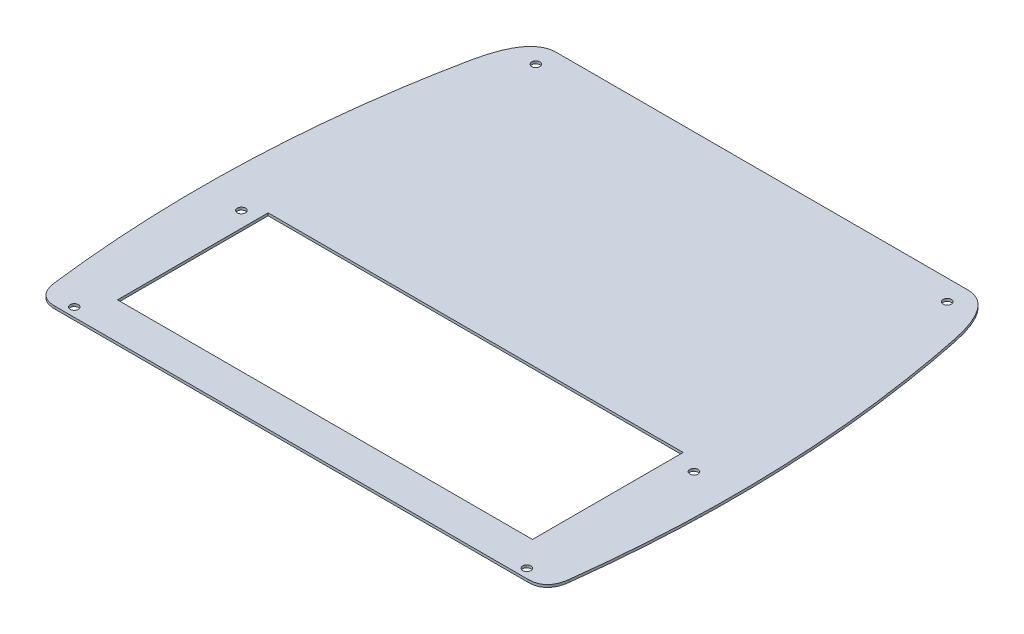
ISO-10303-21;
HEADER;
FILE_DESCRIPTION(('STEP AP214'),'2;1');
FILE_NAME('part.step','',(''),(''),'','','');
FILE_SCHEMA(('AUTOMOTIVE_DESIGN { 1 0 10303 214 1 1 1 1 }'));
ENDSEC;
DATA;
#1=APPLICATION_CONTEXT('core data for automotive mechanical design processes');
#2=APPLICATION_PROTOCOL_DEFINITION('international standard','automotive_design',2000,#1);
#3=PRODUCT_CONTEXT('',#1,'mechanical');
#4=PRODUCT('Part','Part','',(#3));
#5=PRODUCT_RELATED_PRODUCT_CATEGORY('part','',(#4));
#6=PRODUCT_DEFINITION_FORMATION('','',#4);
#7=PRODUCT_DEFINITION_CONTEXT('part definition',#1,'design');
#8=PRODUCT_DEFINITION('design','',#6,#7);
#9=PRODUCT_DEFINITION_SHAPE('','',#8);
#10=(LENGTH_UNIT() NAMED_UNIT(*) SI_UNIT(.MILLI.,.METRE.));
#11=(NAMED_UNIT(*) PLANE_ANGLE_UNIT() SI_UNIT($,.RADIAN.));
#12=(NAMED_UNIT(*) SI_UNIT($,.STERADIAN.) SOLID_ANGLE_UNIT());
#13=UNCERTAINTY_MEASURE_WITH_UNIT(LENGTH_MEASURE(1.E-05),#10,'distance_accuracy_value','');
#14=(GEOMETRIC_REPRESENTATION_CONTEXT(3) GLOBAL_UNCERTAINTY_ASSIGNED_CONTEXT((#13)) GLOBAL_UNIT_ASSIGNED_CONTEXT((#10,
#11,#12)) REPRESENTATION_CONTEXT('',''));
#15=CARTESIAN_POINT('',(0.,0.,0.));
#16=DIRECTION('',(0.,0.,1.));
#17=DIRECTION('',(1.,0.,0.));
#18=AXIS2_PLACEMENT_3D('',#15,#16,#17);
#19=CARTESIAN_POINT('',(-92.,1.,0.));
#20=CARTESIAN_POINT('',(-99.,1.,0.));
#21=CARTESIAN_POINT('',(-100.,1.,-8.));
#22=B_SPLINE_CURVE_WITH_KNOTS('',2,(#19,#20,#21),.UNSPECIFIED.,.F.,.F.,(3,3),(0.,1.),.UNSPECIFIED.);
#23=DIRECTION('',(0.,-1.,0.));
#24=VECTOR('',#23,1.);
#25=SURFACE_OF_LINEAR_EXTRUSION('',#22,#24);
#26=CARTESIAN_POINT('',(-92.,0.,0.));
#27=CARTESIAN_POINT('',(-99.,0.,0.));
#28=CARTESIAN_POINT('',(-100.,0.,-8.));
#29=B_SPLINE_CURVE_WITH_KNOTS('',2,(#26,#27,#28),.UNSPECIFIED.,.F.,.F.,(3,3),(0.,1.),.UNSPECIFIED.);
#30=CARTESIAN_POINT('',(-92.,0.,0.));
#31=VERTEX_POINT('',#30);
#32=CARTESIAN_POINT('',(-100.,0.,-8.));
#33=VERTEX_POINT('',#32);
#34=EDGE_CURVE('E184',#31,#33,#29,.T.);
#35=ORIENTED_EDGE('',*,*,#34,.F.);
#36=DIRECTION('',(0.,-1.,0.));
#37=VECTOR('',#36,1.);
#38=CARTESIAN_POINT('',(-92.,1.,0.));
#39=LINE('',#38,#37);
#40=CARTESIAN_POINT('',(-92.,1.,0.));
#41=VERTEX_POINT('',#40);
#42=EDGE_CURVE('E11',#41,#31,#39,.T.);
#43=ORIENTED_EDGE('',*,*,#42,.F.);
#44=CARTESIAN_POINT('',(-100.,1.,-8.));
#45=VERTEX_POINT('',#44);
#46=EDGE_CURVE('E186',#41,#45,#22,.T.);
#47=ORIENTED_EDGE('',*,*,#46,.T.);
#48=DIRECTION('',(0.,-1.,0.));
#49=VECTOR('',#48,1.);
#50=CARTESIAN_POINT('',(-100.,1.,-8.));
#51=LINE('',#50,#49);
#52=EDGE_CURVE('E36',#45,#33,#51,.T.);
#53=ORIENTED_EDGE('',*,*,#52,.T.);
#54=EDGE_LOOP('',(#35,#43,#47,#53));
#55=FACE_BOUND('',#54,.T.);
#56=ADVANCED_FACE('F32',(#55),#25,.T.);
#57=CARTESIAN_POINT('',(92.,1.,0.));
#58=DIRECTION('',(0.,0.,1.));
#59=DIRECTION('',(1.,0.,0.));
#60=AXIS2_PLACEMENT_3D('',#57,#58,#59);
#61=PLANE('',#60);
#62=DIRECTION('',(-1.,0.,0.));
#63=VECTOR('',#62,1.);
#64=CARTESIAN_POINT('',(92.,0.,0.));
#65=LINE('',#64,#63);
#66=CARTESIAN_POINT('',(92.,0.,0.));
#67=VERTEX_POINT('',#66);
#68=EDGE_CURVE('E193',#67,#31,#65,.T.);
#69=ORIENTED_EDGE('',*,*,#68,.F.);
#70=DIRECTION('',(0.,-1.,0.));
#71=VECTOR('',#70,1.);
#72=CARTESIAN_POINT('',(92.,1.,0.));
#73=LINE('',#72,#71);
#74=CARTESIAN_POINT('',(92.,1.,0.));
#75=VERTEX_POINT('',#74);
#76=EDGE_CURVE('E41',#75,#67,#73,.T.);
#77=ORIENTED_EDGE('',*,*,#76,.F.);
#78=DIRECTION('',(-1.,0.,0.));
#79=VECTOR('',#78,1.);
#80=CARTESIAN_POINT('',(92.,1.,0.));
#81=LINE('',#80,#79);
#82=EDGE_CURVE('E252',#75,#41,#81,.T.);
#83=ORIENTED_EDGE('',*,*,#82,.T.);
#84=ORIENTED_EDGE('',*,*,#42,.T.);
#85=EDGE_LOOP('',(#69,#77,#83,#84));
#86=FACE_BOUND('',#85,.T.);
#87=ADVANCED_FACE('F260',(#86),#61,.T.);
#88=CARTESIAN_POINT('',(92.,1.,0.));
#89=CARTESIAN_POINT('',(99.,1.,0.));
#90=CARTESIAN_POINT('',(100.,1.,-8.));
#91=B_SPLINE_CURVE_WITH_KNOTS('',2,(#88,#89,#90),.UNSPECIFIED.,.F.,.F.,(3,3),(0.,1.),.UNSPECIFIED.);
#92=DIRECTION('',(0.,-1.,0.));
#93=VECTOR('',#92,1.);
#94=SURFACE_OF_LINEAR_EXTRUSION('',#91,#93);
#95=CARTESIAN_POINT('',(92.,0.,0.));
#96=CARTESIAN_POINT('',(99.,0.,0.));
#97=CARTESIAN_POINT('',(100.,0.,-8.));
#98=B_SPLINE_CURVE_WITH_KNOTS('',2,(#95,#96,#97),.UNSPECIFIED.,.F.,.F.,(3,3),(0.,1.),.UNSPECIFIED.);
#99=CARTESIAN_POINT('',(100.,0.,-8.));
#100=VERTEX_POINT('',#99);
#101=EDGE_CURVE('E323',#67,#100,#98,.T.);
#102=ORIENTED_EDGE('',*,*,#101,.T.);
#103=DIRECTION('',(0.,-1.,0.));
#104=VECTOR('',#103,1.);
#105=CARTESIAN_POINT('',(100.,1.,-8.));
#106=LINE('',#105,#104);
#107=CARTESIAN_POINT('',(100.,1.,-8.));
#108=VERTEX_POINT('',#107);
#109=EDGE_CURVE('E332',#108,#100,#106,.T.);
#110=ORIENTED_EDGE('',*,*,#109,.F.);
#111=EDGE_CURVE('E244',#75,#108,#91,.T.);
#112=ORIENTED_EDGE('',*,*,#111,.F.);
#113=ORIENTED_EDGE('',*,*,#76,.T.);
#114=EDGE_LOOP('',(#102,#110,#112,#113));
#115=FACE_BOUND('',#114,.T.);
#116=ADVANCED_FACE('F257',(#115),#94,.F.);
#117=CARTESIAN_POINT('',(100.,1.,-8.));
#118=CARTESIAN_POINT('',(109.749547472412,1.,-87.4036921313057));
#119=CARTESIAN_POINT('',(94.,1.,-164.));
#120=B_SPLINE_CURVE_WITH_KNOTS('',2,(#117,#118,#119),.UNSPECIFIED.,.F.,.F.,(3,3),(0.,1.),.UNSPECIFIED.);
#121=DIRECTION('',(0.,-1.,0.));
#122=VECTOR('',#121,1.);
#123=SURFACE_OF_LINEAR_EXTRUSION('',#120,#122);
#124=CARTESIAN_POINT('',(100.,0.,-8.));
#125=CARTESIAN_POINT('',(109.749547472412,0.,-87.4036921313057));
#126=CARTESIAN_POINT('',(94.,0.,-164.));
#127=B_SPLINE_CURVE_WITH_KNOTS('',2,(#124,#125,#126),.UNSPECIFIED.,.F.,.F.,(3,3),(0.,1.),.UNSPECIFIED.);
#128=CARTESIAN_POINT('',(94.,0.,-164.));
#129=VERTEX_POINT('',#128);
#130=EDGE_CURVE('E325',#100,#129,#127,.T.);
#131=ORIENTED_EDGE('',*,*,#130,.T.);
#132=DIRECTION('',(0.,-1.,0.));
#133=VECTOR('',#132,1.);
#134=CARTESIAN_POINT('',(94.,1.,-164.));
#135=LINE('',#134,#133);
#136=CARTESIAN_POINT('',(94.,1.,-164.));
#137=VERTEX_POINT('',#136);
#138=EDGE_CURVE('E335',#137,#129,#135,.T.);
#139=ORIENTED_EDGE('',*,*,#138,.F.);
#140=EDGE_CURVE('E235',#108,#137,#120,.T.);
#141=ORIENTED_EDGE('',*,*,#140,.F.);
#142=ORIENTED_EDGE('',*,*,#109,.T.);
#143=EDGE_LOOP('',(#131,#139,#141,#142));
#144=FACE_BOUND('',#143,.T.);
#145=ADVANCED_FACE('F227',(#144),#123,.F.);
#146=CARTESIAN_POINT('',(94.,1.,-164.));
#147=CARTESIAN_POINT('',(90.,1.,-183.));
#148=CARTESIAN_POINT('',(80.,1.,-183.));
#149=B_SPLINE_CURVE_WITH_KNOTS('',2,(#146,#147,#148),.UNSPECIFIED.,.F.,.F.,(3,3),(0.,1.),.UNSPECIFIED.);
#150=DIRECTION('',(0.,-1.,0.));
#151=VECTOR('',#150,1.);
#152=SURFACE_OF_LINEAR_EXTRUSION('',#149,#151);
#153=CARTESIAN_POINT('',(94.,0.,-164.));
#154=CARTESIAN_POINT('',(90.,0.,-183.));
#155=CARTESIAN_POINT('',(80.,0.,-183.));
#156=B_SPLINE_CURVE_WITH_KNOTS('',2,(#153,#154,#155),.UNSPECIFIED.,.F.,.F.,(3,3),(0.,1.),.UNSPECIFIED.);
#157=CARTESIAN_POINT('',(80.,0.,-183.));
#158=VERTEX_POINT('',#157);
#159=EDGE_CURVE('E372',#129,#158,#156,.T.);
#160=ORIENTED_EDGE('',*,*,#159,.T.);
#161=DIRECTION('',(0.,-1.,0.));
#162=VECTOR('',#161,1.);
#163=CARTESIAN_POINT('',(80.,1.,-183.));
#164=LINE('',#163,#162);
#165=CARTESIAN_POINT('',(80.,1.,-183.));
#166=VERTEX_POINT('',#165);
#167=EDGE_CURVE('E338',#166,#158,#164,.T.);
#168=ORIENTED_EDGE('',*,*,#167,.F.);
#169=EDGE_CURVE('E231',#137,#166,#149,.T.);
#170=ORIENTED_EDGE('',*,*,#169,.F.);
#171=ORIENTED_EDGE('',*,*,#138,.T.);
#172=EDGE_LOOP('',(#160,#168,#170,#171));
#173=FACE_BOUND('',#172,.T.);
#174=ADVANCED_FACE('F222',(#173),#152,.F.);
#175=CARTESIAN_POINT('',(-80.,1.,-183.));
#176=DIRECTION('',(0.,0.,-1.));
#177=DIRECTION('',(-1.,0.,0.));
#178=AXIS2_PLACEMENT_3D('',#175,#176,#177);
#179=PLANE('',#178);
#180=DIRECTION('',(1.,0.,0.));
#181=VECTOR('',#180,1.);
#182=CARTESIAN_POINT('',(-80.,0.,-183.));
#183=LINE('',#182,#181);
#184=CARTESIAN_POINT('',(-80.,0.,-183.));
#185=VERTEX_POINT('',#184);
#186=EDGE_CURVE('E355',#185,#158,#183,.T.);
#187=ORIENTED_EDGE('',*,*,#186,.F.);
#188=DIRECTION('',(0.,-1.,0.));
#189=VECTOR('',#188,1.);
#190=CARTESIAN_POINT('',(-80.,1.,-183.));
#191=LINE('',#190,#189);
#192=CARTESIAN_POINT('',(-80.,1.,-183.));
#193=VERTEX_POINT('',#192);
#194=EDGE_CURVE('E340',#193,#185,#191,.T.);
#195=ORIENTED_EDGE('',*,*,#194,.F.);
#196=DIRECTION('',(1.,0.,0.));
#197=VECTOR('',#196,1.);
#198=CARTESIAN_POINT('',(-80.,1.,-183.));
#199=LINE('',#198,#197);
#200=EDGE_CURVE('E236',#193,#166,#199,.T.);
#201=ORIENTED_EDGE('',*,*,#200,.T.);
#202=ORIENTED_EDGE('',*,*,#167,.T.);
#203=EDGE_LOOP('',(#187,#195,#201,#202));
#204=FACE_BOUND('',#203,.T.);
#205=ADVANCED_FACE('F218',(#204),#179,.T.);
#206=CARTESIAN_POINT('',(-94.,1.,-164.));
#207=CARTESIAN_POINT('',(-90.,1.,-183.));
#208=CARTESIAN_POINT('',(-80.,1.,-183.));
#209=B_SPLINE_CURVE_WITH_KNOTS('',2,(#206,#207,#208),.UNSPECIFIED.,.F.,.F.,(3,3),(0.,1.),.UNSPECIFIED.);
#210=DIRECTION('',(0.,-1.,0.));
#211=VECTOR('',#210,1.);
#212=SURFACE_OF_LINEAR_EXTRUSION('',#209,#211);
#213=CARTESIAN_POINT('',(-94.,0.,-164.));
#214=CARTESIAN_POINT('',(-90.,0.,-183.));
#215=CARTESIAN_POINT('',(-80.,0.,-183.));
#216=B_SPLINE_CURVE_WITH_KNOTS('',2,(#213,#214,#215),.UNSPECIFIED.,.F.,.F.,(3,3),(0.,1.),.UNSPECIFIED.);
#217=CARTESIAN_POINT('',(-94.,0.,-164.));
#218=VERTEX_POINT('',#217);
#219=EDGE_CURVE('E353',#218,#185,#216,.T.);
#220=ORIENTED_EDGE('',*,*,#219,.F.);
#221=DIRECTION('',(0.,-1.,0.));
#222=VECTOR('',#221,1.);
#223=CARTESIAN_POINT('',(-94.,1.,-164.));
#224=LINE('',#223,#222);
#225=CARTESIAN_POINT('',(-94.,1.,-164.));
#226=VERTEX_POINT('',#225);
#227=EDGE_CURVE('E341',#226,#218,#224,.T.);
#228=ORIENTED_EDGE('',*,*,#227,.F.);
#229=EDGE_CURVE('E202',#226,#193,#209,.T.);
#230=ORIENTED_EDGE('',*,*,#229,.T.);
#231=ORIENTED_EDGE('',*,*,#194,.T.);
#232=EDGE_LOOP('',(#220,#228,#230,#231));
#233=FACE_BOUND('',#232,.T.);
#234=ADVANCED_FACE('F214',(#233),#212,.T.);
#235=CARTESIAN_POINT('',(-100.,1.,-8.));
#236=CARTESIAN_POINT('',(-109.749547472412,1.,-87.4036921313057));
#237=CARTESIAN_POINT('',(-94.,1.,-164.));
#238=B_SPLINE_CURVE_WITH_KNOTS('',2,(#235,#236,#237),.UNSPECIFIED.,.F.,.F.,(3,3),(0.,1.),.UNSPECIFIED.);
#239=DIRECTION('',(0.,-1.,0.));
#240=VECTOR('',#239,1.);
#241=SURFACE_OF_LINEAR_EXTRUSION('',#238,#240);
#242=CARTESIAN_POINT('',(-100.,0.,-8.));
#243=CARTESIAN_POINT('',(-109.749547472412,0.,-87.4036921313057));
#244=CARTESIAN_POINT('',(-94.,0.,-164.));
#245=B_SPLINE_CURVE_WITH_KNOTS('',2,(#242,#243,#244),.UNSPECIFIED.,.F.,.F.,(3,3),(0.,1.),.UNSPECIFIED.);
#246=EDGE_CURVE('E319',#33,#218,#245,.T.);
#247=ORIENTED_EDGE('',*,*,#246,.F.);
#248=ORIENTED_EDGE('',*,*,#52,.F.);
#249=EDGE_CURVE('E192',#45,#226,#238,.T.);
#250=ORIENTED_EDGE('',*,*,#249,.T.);
#251=ORIENTED_EDGE('',*,*,#227,.T.);
#252=EDGE_LOOP('',(#247,#248,#250,#251));
#253=FACE_BOUND('',#252,.T.);
#254=ADVANCED_FACE('F210',(#253),#241,.T.);
#255=CARTESIAN_POINT('',(-97.5,1.,-2.00000000000002));
#256=DIRECTION('',(0.,1.,0.));
#257=DIRECTION('',(0.,0.,1.));
#258=AXIS2_PLACEMENT_3D('',#255,#256,#257);
#259=PLANE('',#258);
#260=DIRECTION('',(0.,0.,-1.));
#261=VECTOR('',#260,1.);
#262=CARTESIAN_POINT('',(79.4,1.,-14.3));
#263=LINE('',#262,#261);
#264=CARTESIAN_POINT('',(79.4,1.,-14.3));
#265=VERTEX_POINT('',#264);
#266=CARTESIAN_POINT('',(79.4,1.,-72.9));
#267=VERTEX_POINT('',#266);
#268=EDGE_CURVE('E49',#265,#267,#263,.T.);
#269=ORIENTED_EDGE('',*,*,#268,.F.);
#270=DIRECTION('',(1.,0.,0.));
#271=VECTOR('',#270,1.);
#272=CARTESIAN_POINT('',(-82.,1.,-14.3));
#273=LINE('',#272,#271);
#274=CARTESIAN_POINT('',(-82.,1.,-14.3));
#275=VERTEX_POINT('',#274);
#276=EDGE_CURVE('E140',#275,#265,#273,.T.);
#277=ORIENTED_EDGE('',*,*,#276,.F.);
#278=DIRECTION('',(0.,0.,1.));
#279=VECTOR('',#278,1.);
#280=CARTESIAN_POINT('',(-82.,1.,-14.3));
#281=LINE('',#280,#279);
#282=CARTESIAN_POINT('',(-82.,1.,-72.9));
#283=VERTEX_POINT('',#282);
#284=EDGE_CURVE('E143',#283,#275,#281,.T.);
#285=ORIENTED_EDGE('',*,*,#284,.F.);
#286=DIRECTION('',(-1.,0.,0.));
#287=VECTOR('',#286,1.);
#288=CARTESIAN_POINT('',(-82.,1.,-72.9));
#289=LINE('',#288,#287);
#290=EDGE_CURVE('E152',#267,#283,#289,.T.);
#291=ORIENTED_EDGE('',*,*,#290,.F.);
#292=EDGE_LOOP('',(#269,#277,#285,#291));
#293=FACE_BOUND('',#292,.T.);
#294=CARTESIAN_POINT('',(88.,1.,-68.5));
#295=DIRECTION('',(0.,1.,0.));
#296=DIRECTION('',(0.,0.,1.));
#297=AXIS2_PLACEMENT_3D('',#294,#295,#296);
#298=CIRCLE('',#297,1.60000000000001);
#299=CARTESIAN_POINT('',(88.,1.,-66.9));
#300=VERTEX_POINT('',#299);
#301=EDGE_CURVE('E518',#300,#300,#298,.T.);
#302=ORIENTED_EDGE('',*,*,#301,.F.);
#303=EDGE_LOOP('',(#302));
#304=FACE_BOUND('',#303,.T.);
#305=CARTESIAN_POINT('',(-88.,1.,-68.5));
#306=DIRECTION('',(0.,1.,0.));
#307=DIRECTION('',(0.,0.,1.));
#308=AXIS2_PLACEMENT_3D('',#305,#306,#307);
#309=CIRCLE('',#308,1.60000000000001);
#310=CARTESIAN_POINT('',(-88.,1.,-66.9));
#311=VERTEX_POINT('',#310);
#312=EDGE_CURVE('E146',#311,#311,#309,.T.);
#313=ORIENTED_EDGE('',*,*,#312,.F.);
#314=EDGE_LOOP('',(#313));
#315=FACE_BOUND('',#314,.T.);
#316=CARTESIAN_POINT('',(80.,1.,-175.));
#317=DIRECTION('',(0.,1.,0.));
#318=DIRECTION('',(0.,0.,-1.));
#319=AXIS2_PLACEMENT_3D('',#316,#317,#318);
#320=CIRCLE('',#319,1.6);
#321=CARTESIAN_POINT('',(80.,1.,-176.6));
#322=VERTEX_POINT('',#321);
#323=EDGE_CURVE('E166',#322,#322,#320,.T.);
#324=ORIENTED_EDGE('',*,*,#323,.F.);
#325=EDGE_LOOP('',(#324));
#326=FACE_BOUND('',#325,.T.);
#327=CARTESIAN_POINT('',(88.,1.,-3.5));
#328=DIRECTION('',(0.,1.,0.));
#329=DIRECTION('',(0.,0.,-1.));
#330=AXIS2_PLACEMENT_3D('',#327,#328,#329);
#331=CIRCLE('',#330,1.60000000000001);
#332=CARTESIAN_POINT('',(88.,1.,-5.1));
#333=VERTEX_POINT('',#332);
#334=EDGE_CURVE('E167',#333,#333,#331,.T.);
#335=ORIENTED_EDGE('',*,*,#334,.F.);
#336=EDGE_LOOP('',(#335));
#337=FACE_BOUND('',#336,.T.);
#338=CARTESIAN_POINT('',(-80.,1.,-175.));
#339=DIRECTION('',(0.,1.,0.));
#340=DIRECTION('',(0.,0.,1.));
#341=AXIS2_PLACEMENT_3D('',#338,#339,#340);
#342=CIRCLE('',#341,1.6);
#343=CARTESIAN_POINT('',(-80.,1.,-173.4));
#344=VERTEX_POINT('',#343);
#345=EDGE_CURVE('E159',#344,#344,#342,.T.);
#346=ORIENTED_EDGE('',*,*,#345,.F.);
#347=EDGE_LOOP('',(#346));
#348=FACE_BOUND('',#347,.T.);
#349=CARTESIAN_POINT('',(-88.,1.,-3.5));
#350=DIRECTION('',(0.,1.,0.));
#351=DIRECTION('',(0.,0.,1.));
#352=AXIS2_PLACEMENT_3D('',#349,#350,#351);
#353=CIRCLE('',#352,1.60000000000001);
#354=CARTESIAN_POINT('',(-88.,1.,-1.89999999999999));
#355=VERTEX_POINT('',#354);
#356=EDGE_CURVE('E178',#355,#355,#353,.T.);
#357=ORIENTED_EDGE('',*,*,#356,.F.);
#358=EDGE_LOOP('',(#357));
#359=FACE_BOUND('',#358,.T.);
#360=ORIENTED_EDGE('',*,*,#46,.F.);
#361=ORIENTED_EDGE('',*,*,#82,.F.);
#362=ORIENTED_EDGE('',*,*,#111,.T.);
#363=ORIENTED_EDGE('',*,*,#140,.T.);
#364=ORIENTED_EDGE('',*,*,#169,.T.);
#365=ORIENTED_EDGE('',*,*,#200,.F.);
#366=ORIENTED_EDGE('',*,*,#229,.F.);
#367=ORIENTED_EDGE('',*,*,#249,.F.);
#368=EDGE_LOOP('',(#360,#361,#362,#363,#364,#365,#366,#367));
#369=FACE_BOUND('',#368,.T.);
#370=ADVANCED_FACE('F213',(#293,#304,#315,#326,#337,#348,#359,#369),#259,.T.);
#371=CARTESIAN_POINT('',(-97.5,0.,-2.00000000000002));
#372=DIRECTION('',(0.,1.,0.));
#373=DIRECTION('',(0.,0.,1.));
#374=AXIS2_PLACEMENT_3D('',#371,#372,#373);
#375=PLANE('',#374);
#376=DIRECTION('',(1.,0.,0.));
#377=VECTOR('',#376,1.);
#378=CARTESIAN_POINT('',(-82.,0.,-14.3));
#379=LINE('',#378,#377);
#380=CARTESIAN_POINT('',(-82.,0.,-14.3));
#381=VERTEX_POINT('',#380);
#382=CARTESIAN_POINT('',(79.4,0.,-14.3));
#383=VERTEX_POINT('',#382);
#384=EDGE_CURVE('E130',#381,#383,#379,.T.);
#385=ORIENTED_EDGE('',*,*,#384,.T.);
#386=DIRECTION('',(0.,0.,-1.));
#387=VECTOR('',#386,1.);
#388=CARTESIAN_POINT('',(79.4,0.,-14.3));
#389=LINE('',#388,#387);
#390=CARTESIAN_POINT('',(79.4,0.,-72.9));
#391=VERTEX_POINT('',#390);
#392=EDGE_CURVE('E124',#383,#391,#389,.T.);
#393=ORIENTED_EDGE('',*,*,#392,.T.);
#394=DIRECTION('',(-1.,0.,0.));
#395=VECTOR('',#394,1.);
#396=CARTESIAN_POINT('',(-82.,0.,-72.9));
#397=LINE('',#396,#395);
#398=CARTESIAN_POINT('',(-82.,0.,-72.9));
#399=VERTEX_POINT('',#398);
#400=EDGE_CURVE('E133',#391,#399,#397,.T.);
#401=ORIENTED_EDGE('',*,*,#400,.T.);
#402=DIRECTION('',(0.,0.,1.));
#403=VECTOR('',#402,1.);
#404=CARTESIAN_POINT('',(-82.,0.,-14.3));
#405=LINE('',#404,#403);
#406=EDGE_CURVE('E57',#399,#381,#405,.T.);
#407=ORIENTED_EDGE('',*,*,#406,.T.);
#408=EDGE_LOOP('',(#385,#393,#401,#407));
#409=FACE_BOUND('',#408,.T.);
#410=CARTESIAN_POINT('',(88.,0.,-68.5));
#411=DIRECTION('',(0.,1.,0.));
#412=DIRECTION('',(0.,0.,1.));
#413=AXIS2_PLACEMENT_3D('',#410,#411,#412);
#414=CIRCLE('',#413,1.60000000000001);
#415=CARTESIAN_POINT('',(88.,0.,-66.9));
#416=VERTEX_POINT('',#415);
#417=EDGE_CURVE('E153',#416,#416,#414,.T.);
#418=ORIENTED_EDGE('',*,*,#417,.T.);
#419=EDGE_LOOP('',(#418));
#420=FACE_BOUND('',#419,.T.);
#421=CARTESIAN_POINT('',(-88.,0.,-68.5));
#422=DIRECTION('',(0.,1.,0.));
#423=DIRECTION('',(0.,0.,1.));
#424=AXIS2_PLACEMENT_3D('',#421,#422,#423);
#425=CIRCLE('',#424,1.60000000000001);
#426=CARTESIAN_POINT('',(-88.,0.,-66.9));
#427=VERTEX_POINT('',#426);
#428=EDGE_CURVE('E520',#427,#427,#425,.T.);
#429=ORIENTED_EDGE('',*,*,#428,.T.);
#430=EDGE_LOOP('',(#429));
#431=FACE_BOUND('',#430,.T.);
#432=CARTESIAN_POINT('',(80.,0.,-175.));
#433=DIRECTION('',(0.,1.,0.));
#434=DIRECTION('',(0.,0.,-1.));
#435=AXIS2_PLACEMENT_3D('',#432,#433,#434);
#436=CIRCLE('',#435,1.6);
#437=CARTESIAN_POINT('',(80.,0.,-176.6));
#438=VERTEX_POINT('',#437);
#439=EDGE_CURVE('E175',#438,#438,#436,.T.);
#440=ORIENTED_EDGE('',*,*,#439,.T.);
#441=EDGE_LOOP('',(#440));
#442=FACE_BOUND('',#441,.T.);
#443=CARTESIAN_POINT('',(88.,0.,-3.5));
#444=DIRECTION('',(0.,1.,0.));
#445=DIRECTION('',(0.,0.,-1.));
#446=AXIS2_PLACEMENT_3D('',#443,#444,#445);
#447=CIRCLE('',#446,1.60000000000001);
#448=CARTESIAN_POINT('',(88.,0.,-5.1));
#449=VERTEX_POINT('',#448);
#450=EDGE_CURVE('E163',#449,#449,#447,.T.);
#451=ORIENTED_EDGE('',*,*,#450,.T.);
#452=EDGE_LOOP('',(#451));
#453=FACE_BOUND('',#452,.T.);
#454=CARTESIAN_POINT('',(-80.,0.,-175.));
#455=DIRECTION('',(0.,1.,0.));
#456=DIRECTION('',(0.,0.,1.));
#457=AXIS2_PLACEMENT_3D('',#454,#455,#456);
#458=CIRCLE('',#457,1.6);
#459=CARTESIAN_POINT('',(-80.,0.,-173.4));
#460=VERTEX_POINT('',#459);
#461=EDGE_CURVE('E170',#460,#460,#458,.T.);
#462=ORIENTED_EDGE('',*,*,#461,.T.);
#463=EDGE_LOOP('',(#462));
#464=FACE_BOUND('',#463,.T.);
#465=CARTESIAN_POINT('',(-88.,0.,-3.5));
#466=DIRECTION('',(0.,1.,0.));
#467=DIRECTION('',(0.,0.,1.));
#468=AXIS2_PLACEMENT_3D('',#465,#466,#467);
#469=CIRCLE('',#468,1.60000000000001);
#470=CARTESIAN_POINT('',(-88.,0.,-1.89999999999999));
#471=VERTEX_POINT('',#470);
#472=EDGE_CURVE('E181',#471,#471,#469,.T.);
#473=ORIENTED_EDGE('',*,*,#472,.T.);
#474=EDGE_LOOP('',(#473));
#475=FACE_BOUND('',#474,.T.);
#476=ORIENTED_EDGE('',*,*,#34,.T.);
#477=ORIENTED_EDGE('',*,*,#246,.T.);
#478=ORIENTED_EDGE('',*,*,#219,.T.);
#479=ORIENTED_EDGE('',*,*,#186,.T.);
#480=ORIENTED_EDGE('',*,*,#159,.F.);
#481=ORIENTED_EDGE('',*,*,#130,.F.);
#482=ORIENTED_EDGE('',*,*,#101,.F.);
#483=ORIENTED_EDGE('',*,*,#68,.T.);
#484=EDGE_LOOP('',(#476,#477,#478,#479,#480,#481,#482,#483));
#485=FACE_BOUND('',#484,.T.);
#486=ADVANCED_FACE('F137',(#409,#420,#431,#442,#453,#464,#475,#485),#375,.F.);
#487=CARTESIAN_POINT('',(-88.,0.,-3.5));
#488=DIRECTION('',(0.,1.,0.));
#489=DIRECTION('',(0.,0.,1.));
#490=AXIS2_PLACEMENT_3D('',#487,#488,#489);
#491=CYLINDRICAL_SURFACE('',#490,1.60000000000001);
#492=ORIENTED_EDGE('',*,*,#472,.F.);
#493=EDGE_LOOP('',(#492));
#494=FACE_BOUND('',#493,.T.);
#495=ORIENTED_EDGE('',*,*,#356,.T.);
#496=EDGE_LOOP('',(#495));
#497=FACE_BOUND('',#496,.T.);
#498=ADVANCED_FACE('F267',(#494,#497),#491,.F.);
#499=CARTESIAN_POINT('',(-80.,0.,-175.));
#500=DIRECTION('',(0.,1.,0.));
#501=DIRECTION('',(0.,0.,1.));
#502=AXIS2_PLACEMENT_3D('',#499,#500,#501);
#503=CYLINDRICAL_SURFACE('',#502,1.6);
#504=ORIENTED_EDGE('',*,*,#461,.F.);
#505=EDGE_LOOP('',(#504));
#506=FACE_BOUND('',#505,.T.);
#507=ORIENTED_EDGE('',*,*,#345,.T.);
#508=EDGE_LOOP('',(#507));
#509=FACE_BOUND('',#508,.T.);
#510=ADVANCED_FACE('F273',(#506,#509),#503,.F.);
#511=CARTESIAN_POINT('',(88.,0.,-3.5));
#512=DIRECTION('',(0.,1.,0.));
#513=DIRECTION('',(0.,0.,1.));
#514=AXIS2_PLACEMENT_3D('',#511,#512,#513);
#515=CYLINDRICAL_SURFACE('',#514,1.60000000000001);
#516=ORIENTED_EDGE('',*,*,#450,.F.);
#517=EDGE_LOOP('',(#516));
#518=FACE_BOUND('',#517,.T.);
#519=ORIENTED_EDGE('',*,*,#334,.T.);
#520=EDGE_LOOP('',(#519));
#521=FACE_BOUND('',#520,.T.);
#522=ADVANCED_FACE('F279',(#518,#521),#515,.F.);
#523=CARTESIAN_POINT('',(80.,0.,-175.));
#524=DIRECTION('',(0.,1.,0.));
#525=DIRECTION('',(0.,0.,1.));
#526=AXIS2_PLACEMENT_3D('',#523,#524,#525);
#527=CYLINDRICAL_SURFACE('',#526,1.6);
#528=ORIENTED_EDGE('',*,*,#439,.F.);
#529=EDGE_LOOP('',(#528));
#530=FACE_BOUND('',#529,.T.);
#531=ORIENTED_EDGE('',*,*,#323,.T.);
#532=EDGE_LOOP('',(#531));
#533=FACE_BOUND('',#532,.T.);
#534=ADVANCED_FACE('F275',(#530,#533),#527,.F.);
#535=CARTESIAN_POINT('',(-88.,0.,-68.5));
#536=DIRECTION('',(0.,1.,0.));
#537=DIRECTION('',(0.,0.,1.));
#538=AXIS2_PLACEMENT_3D('',#535,#536,#537);
#539=CYLINDRICAL_SURFACE('',#538,1.60000000000001);
#540=ORIENTED_EDGE('',*,*,#428,.F.);
#541=EDGE_LOOP('',(#540));
#542=FACE_BOUND('',#541,.T.);
#543=ORIENTED_EDGE('',*,*,#312,.T.);
#544=EDGE_LOOP('',(#543));
#545=FACE_BOUND('',#544,.T.);
#546=ADVANCED_FACE('F278',(#542,#545),#539,.F.);
#547=CARTESIAN_POINT('',(88.,0.,-68.5));
#548=DIRECTION('',(0.,1.,0.));
#549=DIRECTION('',(0.,0.,1.));
#550=AXIS2_PLACEMENT_3D('',#547,#548,#549);
#551=CYLINDRICAL_SURFACE('',#550,1.60000000000001);
#552=ORIENTED_EDGE('',*,*,#417,.F.);
#553=EDGE_LOOP('',(#552));
#554=FACE_BOUND('',#553,.T.);
#555=ORIENTED_EDGE('',*,*,#301,.T.);
#556=EDGE_LOOP('',(#555));
#557=FACE_BOUND('',#556,.T.);
#558=ADVANCED_FACE('F290',(#554,#557),#551,.F.);
#559=CARTESIAN_POINT('',(79.4,0.,-14.3));
#560=DIRECTION('',(1.,0.,0.));
#561=DIRECTION('',(0.,0.,-1.));
#562=AXIS2_PLACEMENT_3D('',#559,#560,#561);
#563=PLANE('',#562);
#564=ORIENTED_EDGE('',*,*,#268,.T.);
#565=DIRECTION('',(0.,1.,0.));
#566=VECTOR('',#565,1.);
#567=CARTESIAN_POINT('',(79.4,0.,-72.9));
#568=LINE('',#567,#566);
#569=EDGE_CURVE('E120',#391,#267,#568,.T.);
#570=ORIENTED_EDGE('',*,*,#569,.F.);
#571=ORIENTED_EDGE('',*,*,#392,.F.);
#572=DIRECTION('',(0.,1.,0.));
#573=VECTOR('',#572,1.);
#574=CARTESIAN_POINT('',(79.4,0.,-14.3));
#575=LINE('',#574,#573);
#576=EDGE_CURVE('E157',#383,#265,#575,.T.);
#577=ORIENTED_EDGE('',*,*,#576,.T.);
#578=EDGE_LOOP('',(#564,#570,#571,#577));
#579=FACE_BOUND('',#578,.T.);
#580=ADVANCED_FACE('F122',(#579),#563,.F.);
#581=CARTESIAN_POINT('',(-82.,0.,-14.3));
#582=DIRECTION('',(0.,0.,1.));
#583=DIRECTION('',(1.,0.,0.));
#584=AXIS2_PLACEMENT_3D('',#581,#582,#583);
#585=PLANE('',#584);
#586=ORIENTED_EDGE('',*,*,#276,.T.);
#587=ORIENTED_EDGE('',*,*,#576,.F.);
#588=ORIENTED_EDGE('',*,*,#384,.F.);
#589=DIRECTION('',(0.,1.,0.));
#590=VECTOR('',#589,1.);
#591=CARTESIAN_POINT('',(-82.,0.,-14.3));
#592=LINE('',#591,#590);
#593=EDGE_CURVE('E160',#381,#275,#592,.T.);
#594=ORIENTED_EDGE('',*,*,#593,.T.);
#595=EDGE_LOOP('',(#586,#587,#588,#594));
#596=FACE_BOUND('',#595,.T.);
#597=ADVANCED_FACE('F289',(#596),#585,.F.);
#598=CARTESIAN_POINT('',(-82.,0.,-14.3));
#599=DIRECTION('',(-1.,0.,0.));
#600=DIRECTION('',(0.,0.,1.));
#601=AXIS2_PLACEMENT_3D('',#598,#599,#600);
#602=PLANE('',#601);
#603=ORIENTED_EDGE('',*,*,#284,.T.);
#604=ORIENTED_EDGE('',*,*,#593,.F.);
#605=ORIENTED_EDGE('',*,*,#406,.F.);
#606=DIRECTION('',(0.,1.,0.));
#607=VECTOR('',#606,1.);
#608=CARTESIAN_POINT('',(-82.,0.,-72.9));
#609=LINE('',#608,#607);
#610=EDGE_CURVE('E129',#399,#283,#609,.T.);
#611=ORIENTED_EDGE('',*,*,#610,.T.);
#612=EDGE_LOOP('',(#603,#604,#605,#611));
#613=FACE_BOUND('',#612,.T.);
#614=ADVANCED_FACE('F293',(#613),#602,.F.);
#615=CARTESIAN_POINT('',(-82.,0.,-72.9));
#616=DIRECTION('',(0.,0.,-1.));
#617=DIRECTION('',(-1.,0.,0.));
#618=AXIS2_PLACEMENT_3D('',#615,#616,#617);
#619=PLANE('',#618);
#620=ORIENTED_EDGE('',*,*,#290,.T.);
#621=ORIENTED_EDGE('',*,*,#610,.F.);
#622=ORIENTED_EDGE('',*,*,#400,.F.);
#623=ORIENTED_EDGE('',*,*,#569,.T.);
#624=EDGE_LOOP('',(#620,#621,#622,#623));
#625=FACE_BOUND('',#624,.T.);
#626=ADVANCED_FACE('F134',(#625),#619,.F.);
#627=CLOSED_SHELL('',(#56,#87,#116,#145,#174,#205,#234,#254,#370,#486,#498,#510,#522,#534,#546,
#558,#580,#597,#614,#626));
#628=MANIFOLD_SOLID_BREP('B2',#627);
#629=ADVANCED_BREP_SHAPE_REPRESENTATION('',(#18,#628),#14);
#630=SHAPE_DEFINITION_REPRESENTATION(#9,#629);
ENDSEC;
END-ISO-10303-21;
